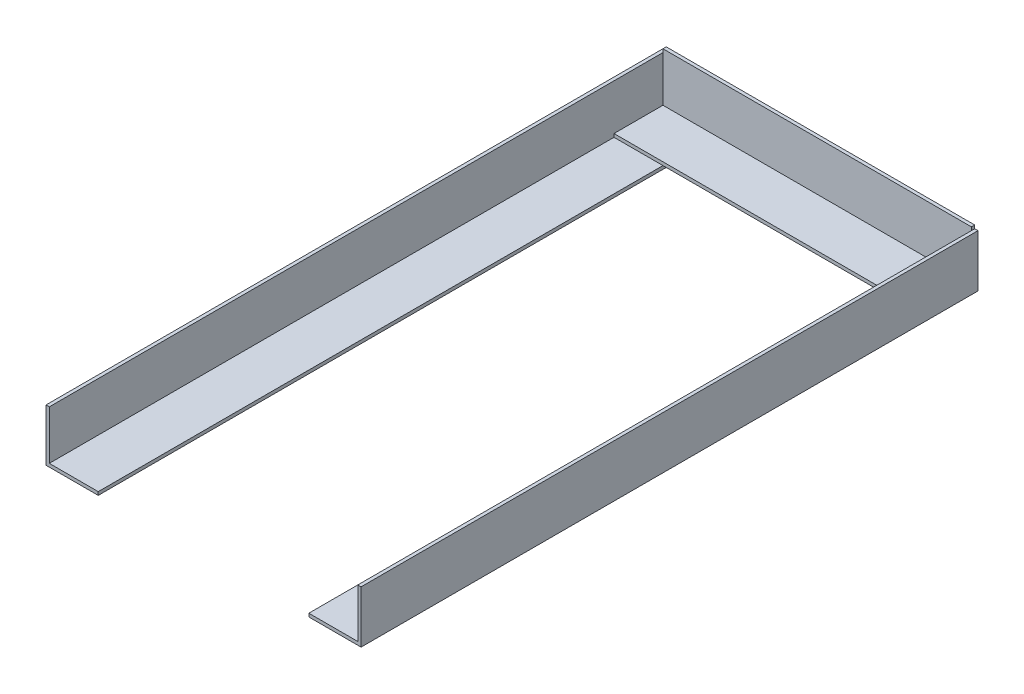
ISO-10303-21;
HEADER;
FILE_DESCRIPTION(('STEP AP214'),'2;1');
FILE_NAME('part.step','',(''),(''),'','','');
FILE_SCHEMA(('AUTOMOTIVE_DESIGN { 1 0 10303 214 1 1 1 1 }'));
ENDSEC;
DATA;
#1=APPLICATION_CONTEXT('core data for automotive mechanical design processes');
#2=APPLICATION_PROTOCOL_DEFINITION('international standard','automotive_design',2000,#1);
#3=PRODUCT_CONTEXT('',#1,'mechanical');
#4=PRODUCT('Part','Part','',(#3));
#5=PRODUCT_RELATED_PRODUCT_CATEGORY('part','',(#4));
#6=PRODUCT_DEFINITION_FORMATION('','',#4);
#7=PRODUCT_DEFINITION_CONTEXT('part definition',#1,'design');
#8=PRODUCT_DEFINITION('design','',#6,#7);
#9=PRODUCT_DEFINITION_SHAPE('','',#8);
#10=(LENGTH_UNIT() NAMED_UNIT(*) SI_UNIT(.MILLI.,.METRE.));
#11=(NAMED_UNIT(*) PLANE_ANGLE_UNIT() SI_UNIT($,.RADIAN.));
#12=(NAMED_UNIT(*) SI_UNIT($,.STERADIAN.) SOLID_ANGLE_UNIT());
#13=UNCERTAINTY_MEASURE_WITH_UNIT(LENGTH_MEASURE(1.E-05),#10,'distance_accuracy_value','');
#14=(GEOMETRIC_REPRESENTATION_CONTEXT(3) GLOBAL_UNCERTAINTY_ASSIGNED_CONTEXT((#13)) GLOBAL_UNIT_ASSIGNED_CONTEXT((#10,
#11,#12)) REPRESENTATION_CONTEXT('',''));
#15=CARTESIAN_POINT('',(0.,0.,0.));
#16=DIRECTION('',(0.,0.,1.));
#17=DIRECTION('',(1.,0.,0.));
#18=AXIS2_PLACEMENT_3D('',#15,#16,#17);
#19=CARTESIAN_POINT('',(1.6002,1.6002,-300.));
#20=DIRECTION('',(1.,0.,0.));
#21=DIRECTION('',(0.,0.,-1.));
#22=AXIS2_PLACEMENT_3D('',#19,#20,#21);
#23=PLANE('',#22);
#24=DIRECTION('',(0.,0.,1.));
#25=VECTOR('',#24,1.);
#26=CARTESIAN_POINT('',(1.6002,1.6002,-300.));
#27=LINE('',#26,#25);
#28=CARTESIAN_POINT('',(1.6002,1.6002,-274.6));
#29=VERTEX_POINT('',#28);
#30=CARTESIAN_POINT('',(1.6002,1.6002,0.));
#31=VERTEX_POINT('',#30);
#32=EDGE_CURVE('E294',#29,#31,#27,.T.);
#33=ORIENTED_EDGE('',*,*,#32,.F.);
#34=DIRECTION('',(0.,-1.,0.));
#35=VECTOR('',#34,1.);
#36=CARTESIAN_POINT('',(1.6002,1.6002,-274.6));
#37=LINE('',#36,#35);
#38=CARTESIAN_POINT('',(1.6002,3.2004,-274.6));
#39=VERTEX_POINT('',#38);
#40=EDGE_CURVE('E202',#39,#29,#37,.T.);
#41=ORIENTED_EDGE('',*,*,#40,.F.);
#42=DIRECTION('',(0.,0.,1.));
#43=VECTOR('',#42,1.);
#44=CARTESIAN_POINT('',(1.6002,3.2004,-274.6));
#45=LINE('',#44,#43);
#46=CARTESIAN_POINT('',(1.6002,3.2004,-298.3998));
#47=VERTEX_POINT('',#46);
#48=EDGE_CURVE('E216',#47,#39,#45,.T.);
#49=ORIENTED_EDGE('',*,*,#48,.F.);
#50=DIRECTION('',(0.,-1.,0.));
#51=VECTOR('',#50,1.);
#52=CARTESIAN_POINT('',(1.6002,3.2004,-298.3998));
#53=LINE('',#52,#51);
#54=CARTESIAN_POINT('',(1.6002,25.4,-298.3998));
#55=VERTEX_POINT('',#54);
#56=EDGE_CURVE('E234',#55,#47,#53,.T.);
#57=ORIENTED_EDGE('',*,*,#56,.F.);
#58=DIRECTION('',(0.,0.,1.));
#59=VECTOR('',#58,1.);
#60=CARTESIAN_POINT('',(1.6002,25.4,-300.));
#61=LINE('',#60,#59);
#62=CARTESIAN_POINT('',(1.6002,25.4,0.));
#63=VERTEX_POINT('',#62);
#64=EDGE_CURVE('E293',#55,#63,#61,.T.);
#65=ORIENTED_EDGE('',*,*,#64,.T.);
#66=DIRECTION('',(0.,1.,0.));
#67=VECTOR('',#66,1.);
#68=CARTESIAN_POINT('',(1.6002,1.6002,0.));
#69=LINE('',#68,#67);
#70=EDGE_CURVE('E277',#31,#63,#69,.T.);
#71=ORIENTED_EDGE('',*,*,#70,.F.);
#72=EDGE_LOOP('',(#33,#41,#49,#57,#65,#71));
#73=FACE_BOUND('',#72,.T.);
#74=ADVANCED_FACE('F33',(#73),#23,.T.);
#75=CARTESIAN_POINT('',(25.4,1.6002,-300.));
#76=DIRECTION('',(0.,1.,0.));
#77=DIRECTION('',(0.,0.,1.));
#78=AXIS2_PLACEMENT_3D('',#75,#76,#77);
#79=PLANE('',#78);
#80=DIRECTION('',(0.,0.,1.));
#81=VECTOR('',#80,1.);
#82=CARTESIAN_POINT('',(25.4,1.6002,-300.));
#83=LINE('',#82,#81);
#84=CARTESIAN_POINT('',(25.4,1.6002,-274.6));
#85=VERTEX_POINT('',#84);
#86=CARTESIAN_POINT('',(25.4,1.6002,0.));
#87=VERTEX_POINT('',#86);
#88=EDGE_CURVE('E271',#85,#87,#83,.T.);
#89=ORIENTED_EDGE('',*,*,#88,.F.);
#90=DIRECTION('',(-1.,0.,0.));
#91=VECTOR('',#90,1.);
#92=CARTESIAN_POINT('',(151.6002,1.6002,-274.6));
#93=LINE('',#92,#91);
#94=EDGE_CURVE('E252',#85,#29,#93,.T.);
#95=ORIENTED_EDGE('',*,*,#94,.T.);
#96=ORIENTED_EDGE('',*,*,#32,.T.);
#97=DIRECTION('',(-1.,0.,0.));
#98=VECTOR('',#97,1.);
#99=CARTESIAN_POINT('',(25.4,1.6002,0.));
#100=LINE('',#99,#98);
#101=EDGE_CURVE('E274',#87,#31,#100,.T.);
#102=ORIENTED_EDGE('',*,*,#101,.F.);
#103=EDGE_LOOP('',(#89,#95,#96,#102));
#104=FACE_BOUND('',#103,.T.);
#105=ADVANCED_FACE('F304',(#104),#79,.T.);
#106=CARTESIAN_POINT('',(25.4,0.,-300.));
#107=DIRECTION('',(1.,0.,0.));
#108=DIRECTION('',(0.,0.,-1.));
#109=AXIS2_PLACEMENT_3D('',#106,#107,#108);
#110=PLANE('',#109);
#111=DIRECTION('',(0.,1.,0.));
#112=VECTOR('',#111,1.);
#113=CARTESIAN_POINT('',(25.4,0.,0.));
#114=LINE('',#113,#112);
#115=CARTESIAN_POINT('',(25.4,0.,0.));
#116=VERTEX_POINT('',#115);
#117=EDGE_CURVE('E256',#116,#87,#114,.T.);
#118=ORIENTED_EDGE('',*,*,#117,.F.);
#119=DIRECTION('',(0.,0.,1.));
#120=VECTOR('',#119,1.);
#121=CARTESIAN_POINT('',(25.4,0.,-300.));
#122=LINE('',#121,#120);
#123=CARTESIAN_POINT('',(25.4,0.,-300.));
#124=VERTEX_POINT('',#123);
#125=EDGE_CURVE('E11',#124,#116,#122,.T.);
#126=ORIENTED_EDGE('',*,*,#125,.F.);
#127=DIRECTION('',(0.,1.,0.));
#128=VECTOR('',#127,1.);
#129=CARTESIAN_POINT('',(25.4,0.,-300.));
#130=LINE('',#129,#128);
#131=CARTESIAN_POINT('',(25.4,1.6002,-300.));
#132=VERTEX_POINT('',#131);
#133=EDGE_CURVE('E258',#124,#132,#130,.T.);
#134=ORIENTED_EDGE('',*,*,#133,.T.);
#135=EDGE_CURVE('E37',#132,#85,#83,.T.);
#136=ORIENTED_EDGE('',*,*,#135,.T.);
#137=ORIENTED_EDGE('',*,*,#88,.T.);
#138=EDGE_LOOP('',(#118,#126,#134,#136,#137));
#139=FACE_BOUND('',#138,.T.);
#140=ADVANCED_FACE('F35',(#139),#110,.T.);
#141=CARTESIAN_POINT('',(25.4,0.,-300.));
#142=DIRECTION('',(0.,-1.,0.));
#143=DIRECTION('',(1.,0.,0.));
#144=AXIS2_PLACEMENT_3D('',#141,#142,#143);
#145=PLANE('',#144);
#146=DIRECTION('',(1.,0.,0.));
#147=VECTOR('',#146,1.);
#148=CARTESIAN_POINT('',(25.4,0.,0.));
#149=LINE('',#148,#147);
#150=CARTESIAN_POINT('',(0.,0.,0.));
#151=VERTEX_POINT('',#150);
#152=EDGE_CURVE('E262',#151,#116,#149,.T.);
#153=ORIENTED_EDGE('',*,*,#152,.F.);
#154=DIRECTION('',(0.,0.,1.));
#155=VECTOR('',#154,1.);
#156=CARTESIAN_POINT('',(0.,0.,-300.));
#157=LINE('',#156,#155);
#158=CARTESIAN_POINT('',(0.,0.,-300.));
#159=VERTEX_POINT('',#158);
#160=EDGE_CURVE('E42',#159,#151,#157,.T.);
#161=ORIENTED_EDGE('',*,*,#160,.F.);
#162=DIRECTION('',(1.,0.,0.));
#163=VECTOR('',#162,1.);
#164=CARTESIAN_POINT('',(25.4,0.,-300.));
#165=LINE('',#164,#163);
#166=EDGE_CURVE('E268',#159,#124,#165,.T.);
#167=ORIENTED_EDGE('',*,*,#166,.T.);
#168=ORIENTED_EDGE('',*,*,#125,.T.);
#169=EDGE_LOOP('',(#153,#161,#167,#168));
#170=FACE_BOUND('',#169,.T.);
#171=ADVANCED_FACE('F310',(#170),#145,.T.);
#172=CARTESIAN_POINT('',(0.,0.,-300.));
#173=DIRECTION('',(-1.,0.,0.));
#174=DIRECTION('',(0.,0.,1.));
#175=AXIS2_PLACEMENT_3D('',#172,#173,#174);
#176=PLANE('',#175);
#177=DIRECTION('',(0.,-1.,0.));
#178=VECTOR('',#177,1.);
#179=CARTESIAN_POINT('',(0.,0.,0.));
#180=LINE('',#179,#178);
#181=CARTESIAN_POINT('',(0.,25.4,0.));
#182=VERTEX_POINT('',#181);
#183=EDGE_CURVE('E283',#182,#151,#180,.T.);
#184=ORIENTED_EDGE('',*,*,#183,.F.);
#185=DIRECTION('',(0.,0.,1.));
#186=VECTOR('',#185,1.);
#187=CARTESIAN_POINT('',(0.,25.4,-300.));
#188=LINE('',#187,#186);
#189=CARTESIAN_POINT('',(0.,25.4,-300.));
#190=VERTEX_POINT('',#189);
#191=EDGE_CURVE('E289',#190,#182,#188,.T.);
#192=ORIENTED_EDGE('',*,*,#191,.F.);
#193=DIRECTION('',(0.,-1.,0.));
#194=VECTOR('',#193,1.);
#195=CARTESIAN_POINT('',(0.,0.,-300.));
#196=LINE('',#195,#194);
#197=EDGE_CURVE('E265',#190,#159,#196,.T.);
#198=ORIENTED_EDGE('',*,*,#197,.T.);
#199=ORIENTED_EDGE('',*,*,#160,.T.);
#200=EDGE_LOOP('',(#184,#192,#198,#199));
#201=FACE_BOUND('',#200,.T.);
#202=ADVANCED_FACE('F341',(#201),#176,.T.);
#203=CARTESIAN_POINT('',(0.,25.4,-300.));
#204=DIRECTION('',(0.,1.,0.));
#205=DIRECTION('',(0.,0.,1.));
#206=AXIS2_PLACEMENT_3D('',#203,#204,#205);
#207=PLANE('',#206);
#208=DIRECTION('',(-1.,0.,0.));
#209=VECTOR('',#208,1.);
#210=CARTESIAN_POINT('',(0.,25.4,0.));
#211=LINE('',#210,#209);
#212=EDGE_CURVE('E280',#63,#182,#211,.T.);
#213=ORIENTED_EDGE('',*,*,#212,.F.);
#214=ORIENTED_EDGE('',*,*,#64,.F.);
#215=CARTESIAN_POINT('',(1.6002,25.4,-300.));
#216=VERTEX_POINT('',#215);
#217=EDGE_CURVE('E291',#216,#55,#61,.T.);
#218=ORIENTED_EDGE('',*,*,#217,.F.);
#219=DIRECTION('',(-1.,0.,0.));
#220=VECTOR('',#219,1.);
#221=CARTESIAN_POINT('',(0.,25.4,-300.));
#222=LINE('',#221,#220);
#223=EDGE_CURVE('E261',#216,#190,#222,.T.);
#224=ORIENTED_EDGE('',*,*,#223,.T.);
#225=ORIENTED_EDGE('',*,*,#191,.T.);
#226=EDGE_LOOP('',(#213,#214,#218,#224,#225));
#227=FACE_BOUND('',#226,.T.);
#228=ADVANCED_FACE('F338',(#227),#207,.T.);
#229=CARTESIAN_POINT('',(0.,0.,-300.));
#230=DIRECTION('',(0.,0.,1.));
#231=DIRECTION('',(1.,0.,0.));
#232=AXIS2_PLACEMENT_3D('',#229,#230,#231);
#233=PLANE('',#232);
#234=DIRECTION('',(0.,-1.,0.));
#235=VECTOR('',#234,1.);
#236=CARTESIAN_POINT('',(127.8004,0.,-300.));
#237=LINE('',#236,#235);
#238=CARTESIAN_POINT('',(127.8004,1.6002,-300.));
#239=VERTEX_POINT('',#238);
#240=CARTESIAN_POINT('',(127.8004,0.,-300.));
#241=VERTEX_POINT('',#240);
#242=EDGE_CURVE('E168',#239,#241,#237,.T.);
#243=ORIENTED_EDGE('',*,*,#242,.F.);
#244=DIRECTION('',(-1.,0.,0.));
#245=VECTOR('',#244,1.);
#246=CARTESIAN_POINT('',(151.6002,1.6002,-300.));
#247=LINE('',#246,#245);
#248=EDGE_CURVE('E55',#239,#132,#247,.T.);
#249=ORIENTED_EDGE('',*,*,#248,.T.);
#250=ORIENTED_EDGE('',*,*,#133,.F.);
#251=ORIENTED_EDGE('',*,*,#166,.F.);
#252=ORIENTED_EDGE('',*,*,#197,.F.);
#253=ORIENTED_EDGE('',*,*,#223,.F.);
#254=DIRECTION('',(0.,1.,0.));
#255=VECTOR('',#254,1.);
#256=CARTESIAN_POINT('',(1.6002,1.6002,-300.));
#257=LINE('',#256,#255);
#258=CARTESIAN_POINT('',(1.6002,27.0002,-300.));
#259=VERTEX_POINT('',#258);
#260=EDGE_CURVE('E230',#216,#259,#257,.T.);
#261=ORIENTED_EDGE('',*,*,#260,.T.);
#262=DIRECTION('',(-1.,0.,0.));
#263=VECTOR('',#262,1.);
#264=CARTESIAN_POINT('',(151.6002,27.0002,-300.));
#265=LINE('',#264,#263);
#266=CARTESIAN_POINT('',(151.6002,27.0002,-300.));
#267=VERTEX_POINT('',#266);
#268=EDGE_CURVE('E248',#267,#259,#265,.T.);
#269=ORIENTED_EDGE('',*,*,#268,.F.);
#270=DIRECTION('',(0.,1.,0.));
#271=VECTOR('',#270,1.);
#272=CARTESIAN_POINT('',(151.6002,1.6002,-300.));
#273=LINE('',#272,#271);
#274=CARTESIAN_POINT('',(151.6002,25.4,-300.));
#275=VERTEX_POINT('',#274);
#276=EDGE_CURVE('E215',#275,#267,#273,.T.);
#277=ORIENTED_EDGE('',*,*,#276,.F.);
#278=DIRECTION('',(-1.,0.,0.));
#279=VECTOR('',#278,1.);
#280=CARTESIAN_POINT('',(153.2004,25.4,-300.));
#281=LINE('',#280,#279);
#282=CARTESIAN_POINT('',(153.2004,25.4,-300.));
#283=VERTEX_POINT('',#282);
#284=EDGE_CURVE('E178',#283,#275,#281,.T.);
#285=ORIENTED_EDGE('',*,*,#284,.F.);
#286=DIRECTION('',(0.,1.,0.));
#287=VECTOR('',#286,1.);
#288=CARTESIAN_POINT('',(153.2004,0.,-300.));
#289=LINE('',#288,#287);
#290=CARTESIAN_POINT('',(153.2004,0.,-300.));
#291=VERTEX_POINT('',#290);
#292=EDGE_CURVE('E160',#291,#283,#289,.T.);
#293=ORIENTED_EDGE('',*,*,#292,.F.);
#294=DIRECTION('',(1.,0.,0.));
#295=VECTOR('',#294,1.);
#296=CARTESIAN_POINT('',(127.8004,0.,-300.));
#297=LINE('',#296,#295);
#298=EDGE_CURVE('E175',#241,#291,#297,.T.);
#299=ORIENTED_EDGE('',*,*,#298,.F.);
#300=EDGE_LOOP('',(#243,#249,#250,#251,#252,#253,#261,#269,#277,#285,#293,#299));
#301=FACE_BOUND('',#300,.T.);
#302=ADVANCED_FACE('F174',(#301),#233,.F.);
#303=CARTESIAN_POINT('',(0.,0.,0.));
#304=DIRECTION('',(0.,0.,1.));
#305=DIRECTION('',(1.,0.,0.));
#306=AXIS2_PLACEMENT_3D('',#303,#304,#305);
#307=PLANE('',#306);
#308=ORIENTED_EDGE('',*,*,#117,.T.);
#309=ORIENTED_EDGE('',*,*,#101,.T.);
#310=ORIENTED_EDGE('',*,*,#70,.T.);
#311=ORIENTED_EDGE('',*,*,#212,.T.);
#312=ORIENTED_EDGE('',*,*,#183,.T.);
#313=ORIENTED_EDGE('',*,*,#152,.T.);
#314=EDGE_LOOP('',(#308,#309,#310,#311,#312,#313));
#315=FACE_BOUND('',#314,.T.);
#316=ADVANCED_FACE('F306',(#315),#307,.T.);
#317=CARTESIAN_POINT('',(151.6002,1.6002,-274.6));
#318=DIRECTION('',(0.,0.,-1.));
#319=DIRECTION('',(-1.,0.,0.));
#320=AXIS2_PLACEMENT_3D('',#317,#318,#319);
#321=PLANE('',#320);
#322=ORIENTED_EDGE('',*,*,#40,.T.);
#323=ORIENTED_EDGE('',*,*,#94,.F.);
#324=CARTESIAN_POINT('',(127.8004,1.6002,-274.6));
#325=VERTEX_POINT('',#324);
#326=EDGE_CURVE('E257',#325,#85,#93,.T.);
#327=ORIENTED_EDGE('',*,*,#326,.F.);
#328=CARTESIAN_POINT('',(151.6002,1.6002,-274.6));
#329=VERTEX_POINT('',#328);
#330=EDGE_CURVE('E253',#329,#325,#93,.T.);
#331=ORIENTED_EDGE('',*,*,#330,.F.);
#332=DIRECTION('',(0.,-1.,0.));
#333=VECTOR('',#332,1.);
#334=CARTESIAN_POINT('',(151.6002,1.6002,-274.6));
#335=LINE('',#334,#333);
#336=CARTESIAN_POINT('',(151.6002,3.2004,-274.6));
#337=VERTEX_POINT('',#336);
#338=EDGE_CURVE('E212',#337,#329,#335,.T.);
#339=ORIENTED_EDGE('',*,*,#338,.F.);
#340=DIRECTION('',(-1.,0.,0.));
#341=VECTOR('',#340,1.);
#342=CARTESIAN_POINT('',(151.6002,3.2004,-274.6));
#343=LINE('',#342,#341);
#344=EDGE_CURVE('E227',#337,#39,#343,.T.);
#345=ORIENTED_EDGE('',*,*,#344,.T.);
#346=EDGE_LOOP('',(#322,#323,#327,#331,#339,#345));
#347=FACE_BOUND('',#346,.T.);
#348=ADVANCED_FACE('F333',(#347),#321,.F.);
#349=CARTESIAN_POINT('',(151.6002,1.6002,-274.6));
#350=DIRECTION('',(0.,1.,0.));
#351=DIRECTION('',(0.,0.,1.));
#352=AXIS2_PLACEMENT_3D('',#349,#350,#351);
#353=PLANE('',#352);
#354=ORIENTED_EDGE('',*,*,#248,.F.);
#355=DIRECTION('',(0.,0.,1.));
#356=VECTOR('',#355,1.);
#357=CARTESIAN_POINT('',(127.8004,1.6002,-300.));
#358=LINE('',#357,#356);
#359=EDGE_CURVE('E50',#239,#325,#358,.T.);
#360=ORIENTED_EDGE('',*,*,#359,.T.);
#361=ORIENTED_EDGE('',*,*,#326,.T.);
#362=ORIENTED_EDGE('',*,*,#135,.F.);
#363=EDGE_LOOP('',(#354,#360,#361,#362));
#364=FACE_BOUND('',#363,.T.);
#365=ADVANCED_FACE('F388',(#364),#353,.F.);
#366=CARTESIAN_POINT('',(151.6002,27.0002,-298.3998));
#367=DIRECTION('',(0.,-1.,0.));
#368=DIRECTION('',(0.,0.,-1.));
#369=AXIS2_PLACEMENT_3D('',#366,#367,#368);
#370=PLANE('',#369);
#371=DIRECTION('',(0.,0.,1.));
#372=VECTOR('',#371,1.);
#373=CARTESIAN_POINT('',(1.6002,27.0002,-298.3998));
#374=LINE('',#373,#372);
#375=CARTESIAN_POINT('',(1.6002,27.0002,-298.3998));
#376=VERTEX_POINT('',#375);
#377=EDGE_CURVE('E232',#259,#376,#374,.T.);
#378=ORIENTED_EDGE('',*,*,#377,.T.);
#379=DIRECTION('',(-1.,0.,0.));
#380=VECTOR('',#379,1.);
#381=CARTESIAN_POINT('',(151.6002,27.0002,-298.3998));
#382=LINE('',#381,#380);
#383=CARTESIAN_POINT('',(151.6002,27.0002,-298.3998));
#384=VERTEX_POINT('',#383);
#385=EDGE_CURVE('E245',#384,#376,#382,.T.);
#386=ORIENTED_EDGE('',*,*,#385,.F.);
#387=DIRECTION('',(0.,0.,1.));
#388=VECTOR('',#387,1.);
#389=CARTESIAN_POINT('',(151.6002,27.0002,-298.3998));
#390=LINE('',#389,#388);
#391=EDGE_CURVE('E218',#267,#384,#390,.T.);
#392=ORIENTED_EDGE('',*,*,#391,.F.);
#393=ORIENTED_EDGE('',*,*,#268,.T.);
#394=EDGE_LOOP('',(#378,#386,#392,#393));
#395=FACE_BOUND('',#394,.T.);
#396=ADVANCED_FACE('F350',(#395),#370,.F.);
#397=CARTESIAN_POINT('',(151.6002,3.2004,-298.3998));
#398=DIRECTION('',(0.,0.,-1.));
#399=DIRECTION('',(-1.,0.,0.));
#400=AXIS2_PLACEMENT_3D('',#397,#398,#399);
#401=PLANE('',#400);
#402=EDGE_CURVE('E235',#376,#55,#53,.T.);
#403=ORIENTED_EDGE('',*,*,#402,.T.);
#404=ORIENTED_EDGE('',*,*,#56,.T.);
#405=DIRECTION('',(-1.,0.,0.));
#406=VECTOR('',#405,1.);
#407=CARTESIAN_POINT('',(151.6002,3.2004,-298.3998));
#408=LINE('',#407,#406);
#409=CARTESIAN_POINT('',(151.6002,3.2004,-298.3998));
#410=VERTEX_POINT('',#409);
#411=EDGE_CURVE('E242',#410,#47,#408,.T.);
#412=ORIENTED_EDGE('',*,*,#411,.F.);
#413=DIRECTION('',(0.,-1.,0.));
#414=VECTOR('',#413,1.);
#415=CARTESIAN_POINT('',(151.6002,3.2004,-298.3998));
#416=LINE('',#415,#414);
#417=CARTESIAN_POINT('',(151.6002,25.4,-298.3998));
#418=VERTEX_POINT('',#417);
#419=EDGE_CURVE('E220',#418,#410,#416,.T.);
#420=ORIENTED_EDGE('',*,*,#419,.F.);
#421=EDGE_CURVE('E221',#384,#418,#416,.T.);
#422=ORIENTED_EDGE('',*,*,#421,.F.);
#423=ORIENTED_EDGE('',*,*,#385,.T.);
#424=EDGE_LOOP('',(#403,#404,#412,#420,#422,#423));
#425=FACE_BOUND('',#424,.T.);
#426=ADVANCED_FACE('F354',(#425),#401,.F.);
#427=CARTESIAN_POINT('',(151.6002,3.2004,-274.6));
#428=DIRECTION('',(0.,-1.,0.));
#429=DIRECTION('',(0.,0.,-1.));
#430=AXIS2_PLACEMENT_3D('',#427,#428,#429);
#431=PLANE('',#430);
#432=ORIENTED_EDGE('',*,*,#48,.T.);
#433=ORIENTED_EDGE('',*,*,#344,.F.);
#434=DIRECTION('',(0.,0.,1.));
#435=VECTOR('',#434,1.);
#436=CARTESIAN_POINT('',(151.6002,3.2004,-274.6));
#437=LINE('',#436,#435);
#438=EDGE_CURVE('E224',#410,#337,#437,.T.);
#439=ORIENTED_EDGE('',*,*,#438,.F.);
#440=ORIENTED_EDGE('',*,*,#411,.T.);
#441=EDGE_LOOP('',(#432,#433,#439,#440));
#442=FACE_BOUND('',#441,.T.);
#443=ADVANCED_FACE('F395',(#442),#431,.F.);
#444=CARTESIAN_POINT('',(151.6002,0.,0.));
#445=DIRECTION('',(-1.,0.,0.));
#446=DIRECTION('',(0.,0.,1.));
#447=AXIS2_PLACEMENT_3D('',#444,#445,#446);
#448=PLANE('',#447);
#449=ORIENTED_EDGE('',*,*,#421,.T.);
#450=DIRECTION('',(0.,0.,1.));
#451=VECTOR('',#450,1.);
#452=CARTESIAN_POINT('',(151.6002,25.4,-300.));
#453=LINE('',#452,#451);
#454=EDGE_CURVE('E207',#275,#418,#453,.T.);
#455=ORIENTED_EDGE('',*,*,#454,.F.);
#456=ORIENTED_EDGE('',*,*,#276,.T.);
#457=ORIENTED_EDGE('',*,*,#391,.T.);
#458=EDGE_LOOP('',(#449,#455,#456,#457));
#459=FACE_BOUND('',#458,.T.);
#460=ADVANCED_FACE('F358',(#459),#448,.F.);
#461=CARTESIAN_POINT('',(1.6002,0.,0.));
#462=DIRECTION('',(-1.,0.,0.));
#463=DIRECTION('',(0.,0.,1.));
#464=AXIS2_PLACEMENT_3D('',#461,#462,#463);
#465=PLANE('',#464);
#466=ORIENTED_EDGE('',*,*,#260,.F.);
#467=ORIENTED_EDGE('',*,*,#217,.T.);
#468=ORIENTED_EDGE('',*,*,#402,.F.);
#469=ORIENTED_EDGE('',*,*,#377,.F.);
#470=EDGE_LOOP('',(#466,#467,#468,#469));
#471=FACE_BOUND('',#470,.T.);
#472=ADVANCED_FACE('F347',(#471),#465,.T.);
#473=CARTESIAN_POINT('',(151.6002,1.6002,-300.));
#474=DIRECTION('',(-1.,0.,0.));
#475=DIRECTION('',(0.,0.,1.));
#476=AXIS2_PLACEMENT_3D('',#473,#474,#475);
#477=PLANE('',#476);
#478=ORIENTED_EDGE('',*,*,#338,.T.);
#479=DIRECTION('',(0.,0.,1.));
#480=VECTOR('',#479,1.);
#481=CARTESIAN_POINT('',(151.6002,1.6002,-300.));
#482=LINE('',#481,#480);
#483=CARTESIAN_POINT('',(151.6002,1.6002,0.));
#484=VERTEX_POINT('',#483);
#485=EDGE_CURVE('E205',#329,#484,#482,.T.);
#486=ORIENTED_EDGE('',*,*,#485,.T.);
#487=DIRECTION('',(0.,-1.,0.));
#488=VECTOR('',#487,1.);
#489=CARTESIAN_POINT('',(151.6002,1.6002,0.));
#490=LINE('',#489,#488);
#491=CARTESIAN_POINT('',(151.6002,25.4,0.));
#492=VERTEX_POINT('',#491);
#493=EDGE_CURVE('E196',#492,#484,#490,.T.);
#494=ORIENTED_EDGE('',*,*,#493,.F.);
#495=EDGE_CURVE('E210',#418,#492,#453,.T.);
#496=ORIENTED_EDGE('',*,*,#495,.F.);
#497=ORIENTED_EDGE('',*,*,#419,.T.);
#498=ORIENTED_EDGE('',*,*,#438,.T.);
#499=EDGE_LOOP('',(#478,#486,#494,#496,#497,#498));
#500=FACE_BOUND('',#499,.T.);
#501=ADVANCED_FACE('F328',(#500),#477,.T.);
#502=CARTESIAN_POINT('',(127.8004,1.6002,-300.));
#503=DIRECTION('',(0.,1.,0.));
#504=DIRECTION('',(0.,0.,1.));
#505=AXIS2_PLACEMENT_3D('',#502,#503,#504);
#506=PLANE('',#505);
#507=ORIENTED_EDGE('',*,*,#330,.T.);
#508=CARTESIAN_POINT('',(127.8004,1.6002,0.));
#509=VERTEX_POINT('',#508);
#510=EDGE_CURVE('E204',#325,#509,#358,.T.);
#511=ORIENTED_EDGE('',*,*,#510,.T.);
#512=DIRECTION('',(-1.,0.,0.));
#513=VECTOR('',#512,1.);
#514=CARTESIAN_POINT('',(127.8004,1.6002,0.));
#515=LINE('',#514,#513);
#516=EDGE_CURVE('E185',#484,#509,#515,.T.);
#517=ORIENTED_EDGE('',*,*,#516,.F.);
#518=ORIENTED_EDGE('',*,*,#485,.F.);
#519=EDGE_LOOP('',(#507,#511,#517,#518));
#520=FACE_BOUND('',#519,.T.);
#521=ADVANCED_FACE('F320',(#520),#506,.T.);
#522=CARTESIAN_POINT('',(127.8004,0.,-300.));
#523=DIRECTION('',(0.,-1.,0.));
#524=DIRECTION('',(1.,0.,0.));
#525=AXIS2_PLACEMENT_3D('',#522,#523,#524);
#526=PLANE('',#525);
#527=DIRECTION('',(1.,0.,0.));
#528=VECTOR('',#527,1.);
#529=CARTESIAN_POINT('',(127.8004,0.,0.));
#530=LINE('',#529,#528);
#531=CARTESIAN_POINT('',(127.8004,0.,0.));
#532=VERTEX_POINT('',#531);
#533=CARTESIAN_POINT('',(153.2004,0.,0.));
#534=VERTEX_POINT('',#533);
#535=EDGE_CURVE('E190',#532,#534,#530,.T.);
#536=ORIENTED_EDGE('',*,*,#535,.F.);
#537=DIRECTION('',(0.,0.,1.));
#538=VECTOR('',#537,1.);
#539=CARTESIAN_POINT('',(127.8004,0.,-300.));
#540=LINE('',#539,#538);
#541=EDGE_CURVE('E181',#241,#532,#540,.T.);
#542=ORIENTED_EDGE('',*,*,#541,.F.);
#543=ORIENTED_EDGE('',*,*,#298,.T.);
#544=DIRECTION('',(0.,0.,1.));
#545=VECTOR('',#544,1.);
#546=CARTESIAN_POINT('',(153.2004,0.,-300.));
#547=LINE('',#546,#545);
#548=EDGE_CURVE('E157',#291,#534,#547,.T.);
#549=ORIENTED_EDGE('',*,*,#548,.T.);
#550=EDGE_LOOP('',(#536,#542,#543,#549));
#551=FACE_BOUND('',#550,.T.);
#552=ADVANCED_FACE('F180',(#551),#526,.T.);
#553=CARTESIAN_POINT('',(127.8004,0.,-300.));
#554=DIRECTION('',(-1.,0.,0.));
#555=DIRECTION('',(0.,0.,1.));
#556=AXIS2_PLACEMENT_3D('',#553,#554,#555);
#557=PLANE('',#556);
#558=DIRECTION('',(0.,-1.,0.));
#559=VECTOR('',#558,1.);
#560=CARTESIAN_POINT('',(127.8004,0.,0.));
#561=LINE('',#560,#559);
#562=EDGE_CURVE('E182',#509,#532,#561,.T.);
#563=ORIENTED_EDGE('',*,*,#562,.F.);
#564=ORIENTED_EDGE('',*,*,#510,.F.);
#565=ORIENTED_EDGE('',*,*,#359,.F.);
#566=ORIENTED_EDGE('',*,*,#242,.T.);
#567=ORIENTED_EDGE('',*,*,#541,.T.);
#568=EDGE_LOOP('',(#563,#564,#565,#566,#567));
#569=FACE_BOUND('',#568,.T.);
#570=ADVANCED_FACE('F316',(#569),#557,.T.);
#571=CARTESIAN_POINT('',(153.2004,25.4,-300.));
#572=DIRECTION('',(0.,1.,0.));
#573=DIRECTION('',(0.,0.,1.));
#574=AXIS2_PLACEMENT_3D('',#571,#572,#573);
#575=PLANE('',#574);
#576=DIRECTION('',(-1.,0.,0.));
#577=VECTOR('',#576,1.);
#578=CARTESIAN_POINT('',(153.2004,25.4,0.));
#579=LINE('',#578,#577);
#580=CARTESIAN_POINT('',(153.2004,25.4,0.));
#581=VERTEX_POINT('',#580);
#582=EDGE_CURVE('E193',#581,#492,#579,.T.);
#583=ORIENTED_EDGE('',*,*,#582,.F.);
#584=DIRECTION('',(0.,0.,1.));
#585=VECTOR('',#584,1.);
#586=CARTESIAN_POINT('',(153.2004,25.4,-300.));
#587=LINE('',#586,#585);
#588=EDGE_CURVE('E167',#283,#581,#587,.T.);
#589=ORIENTED_EDGE('',*,*,#588,.F.);
#590=ORIENTED_EDGE('',*,*,#284,.T.);
#591=ORIENTED_EDGE('',*,*,#454,.T.);
#592=ORIENTED_EDGE('',*,*,#495,.T.);
#593=EDGE_LOOP('',(#583,#589,#590,#591,#592));
#594=FACE_BOUND('',#593,.T.);
#595=ADVANCED_FACE('F360',(#594),#575,.T.);
#596=CARTESIAN_POINT('',(153.2004,0.,-300.));
#597=DIRECTION('',(1.,0.,0.));
#598=DIRECTION('',(0.,0.,-1.));
#599=AXIS2_PLACEMENT_3D('',#596,#597,#598);
#600=PLANE('',#599);
#601=DIRECTION('',(0.,1.,0.));
#602=VECTOR('',#601,1.);
#603=CARTESIAN_POINT('',(153.2004,0.,0.));
#604=LINE('',#603,#602);
#605=EDGE_CURVE('E162',#534,#581,#604,.T.);
#606=ORIENTED_EDGE('',*,*,#605,.F.);
#607=ORIENTED_EDGE('',*,*,#548,.F.);
#608=ORIENTED_EDGE('',*,*,#292,.T.);
#609=ORIENTED_EDGE('',*,*,#588,.T.);
#610=EDGE_LOOP('',(#606,#607,#608,#609));
#611=FACE_BOUND('',#610,.T.);
#612=ADVANCED_FACE('F159',(#611),#600,.T.);
#613=CARTESIAN_POINT('',(0.,0.,0.));
#614=DIRECTION('',(0.,0.,1.));
#615=DIRECTION('',(1.,0.,0.));
#616=AXIS2_PLACEMENT_3D('',#613,#614,#615);
#617=PLANE('',#616);
#618=ORIENTED_EDGE('',*,*,#535,.T.);
#619=ORIENTED_EDGE('',*,*,#605,.T.);
#620=ORIENTED_EDGE('',*,*,#582,.T.);
#621=ORIENTED_EDGE('',*,*,#493,.T.);
#622=ORIENTED_EDGE('',*,*,#516,.T.);
#623=ORIENTED_EDGE('',*,*,#562,.T.);
#624=EDGE_LOOP('',(#618,#619,#620,#621,#622,#623));
#625=FACE_BOUND('',#624,.T.);
#626=ADVANCED_FACE('F323',(#625),#617,.T.);
#627=CLOSED_SHELL('',(#74,#105,#140,#171,#202,#228,#302,#316,#348,#365,#396,#426,#443,#460,#472,
#501,#521,#552,#570,#595,#612,#626));
#628=MANIFOLD_SOLID_BREP('B2',#627);
#629=ADVANCED_BREP_SHAPE_REPRESENTATION('',(#18,#628),#14);
#630=SHAPE_DEFINITION_REPRESENTATION(#9,#629);
ENDSEC;
END-ISO-10303-21;
